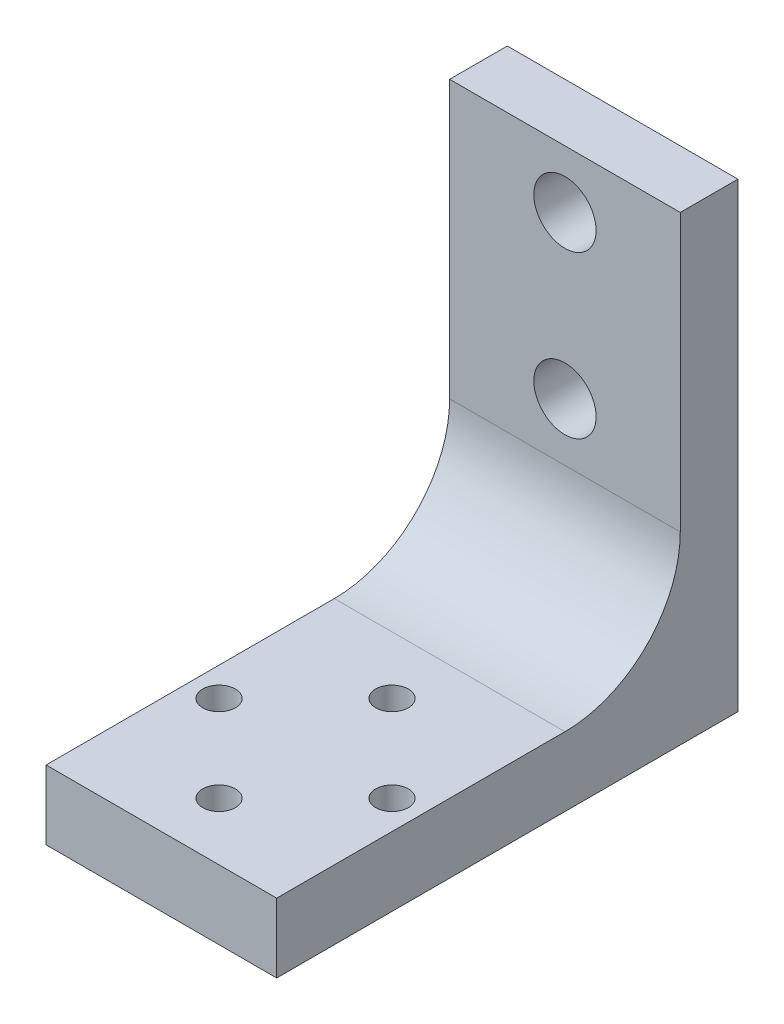
ISO-10303-21;
HEADER;
FILE_DESCRIPTION(('STEP AP214'),'2;1');
FILE_NAME('part.step','',(''),(''),'','','');
FILE_SCHEMA(('AUTOMOTIVE_DESIGN { 1 0 10303 214 1 1 1 1 }'));
ENDSEC;
DATA;
#1=APPLICATION_CONTEXT('core data for automotive mechanical design processes');
#2=APPLICATION_PROTOCOL_DEFINITION('international standard','automotive_design',2000,#1);
#3=PRODUCT_CONTEXT('',#1,'mechanical');
#4=PRODUCT('Part','Part','',(#3));
#5=PRODUCT_RELATED_PRODUCT_CATEGORY('part','',(#4));
#6=PRODUCT_DEFINITION_FORMATION('','',#4);
#7=PRODUCT_DEFINITION_CONTEXT('part definition',#1,'design');
#8=PRODUCT_DEFINITION('design','',#6,#7);
#9=PRODUCT_DEFINITION_SHAPE('','',#8);
#10=(LENGTH_UNIT() NAMED_UNIT(*) SI_UNIT(.MILLI.,.METRE.));
#11=(NAMED_UNIT(*) PLANE_ANGLE_UNIT() SI_UNIT($,.RADIAN.));
#12=(NAMED_UNIT(*) SI_UNIT($,.STERADIAN.) SOLID_ANGLE_UNIT());
#13=UNCERTAINTY_MEASURE_WITH_UNIT(LENGTH_MEASURE(1.E-05),#10,'distance_accuracy_value','');
#14=(GEOMETRIC_REPRESENTATION_CONTEXT(3) GLOBAL_UNCERTAINTY_ASSIGNED_CONTEXT((#13)) GLOBAL_UNIT_ASSIGNED_CONTEXT((#10,
#11,#12)) REPRESENTATION_CONTEXT('',''));
#15=CARTESIAN_POINT('',(0.,0.,0.));
#16=DIRECTION('',(0.,0.,1.));
#17=DIRECTION('',(1.,0.,0.));
#18=AXIS2_PLACEMENT_3D('',#15,#16,#17);
#19=CARTESIAN_POINT('',(0.,0.,6.35));
#20=DIRECTION('',(1.,0.,0.));
#21=DIRECTION('',(0.,0.,-1.));
#22=AXIS2_PLACEMENT_3D('',#19,#20,#21);
#23=PLANE('',#22);
#24=DIRECTION('',(0.,-1.,0.));
#25=VECTOR('',#24,1.);
#26=CARTESIAN_POINT('',(0.,0.,0.));
#27=LINE('',#26,#25);
#28=CARTESIAN_POINT('',(0.,50.8,0.));
#29=VERTEX_POINT('',#28);
#30=CARTESIAN_POINT('',(0.,0.,0.));
#31=VERTEX_POINT('',#30);
#32=EDGE_CURVE('E130',#29,#31,#27,.T.);
#33=ORIENTED_EDGE('',*,*,#32,.T.);
#34=DIRECTION('',(0.,0.,-1.));
#35=VECTOR('',#34,1.);
#36=CARTESIAN_POINT('',(0.,0.,6.35));
#37=LINE('',#36,#35);
#38=CARTESIAN_POINT('',(0.,0.,50.8));
#39=VERTEX_POINT('',#38);
#40=EDGE_CURVE('E117',#39,#31,#37,.T.);
#41=ORIENTED_EDGE('',*,*,#40,.F.);
#42=DIRECTION('',(0.,-1.,0.));
#43=VECTOR('',#42,1.);
#44=CARTESIAN_POINT('',(0.,0.,50.8));
#45=LINE('',#44,#43);
#46=CARTESIAN_POINT('',(0.,7.61999999999999,50.8));
#47=VERTEX_POINT('',#46);
#48=EDGE_CURVE('E104',#47,#39,#45,.T.);
#49=ORIENTED_EDGE('',*,*,#48,.F.);
#50=DIRECTION('',(0.,0.,1.));
#51=VECTOR('',#50,1.);
#52=CARTESIAN_POINT('',(0.,7.61999999999999,50.8));
#53=LINE('',#52,#51);
#54=CARTESIAN_POINT('',(0.,7.61999999999999,19.05));
#55=VERTEX_POINT('',#54);
#56=EDGE_CURVE('E95',#55,#47,#53,.T.);
#57=ORIENTED_EDGE('',*,*,#56,.F.);
#58=CARTESIAN_POINT('',(0.,20.32,19.05));
#59=DIRECTION('',(1.,0.,0.));
#60=DIRECTION('',(0.,0.,-1.));
#61=AXIS2_PLACEMENT_3D('',#58,#59,#60);
#62=CIRCLE('',#61,12.7);
#63=CARTESIAN_POINT('',(0.,20.32,6.35));
#64=VERTEX_POINT('',#63);
#65=EDGE_CURVE('E11',#55,#64,#62,.T.);
#66=ORIENTED_EDGE('',*,*,#65,.T.);
#67=DIRECTION('',(0.,-1.,0.));
#68=VECTOR('',#67,1.);
#69=CARTESIAN_POINT('',(0.,0.,6.35));
#70=LINE('',#69,#68);
#71=CARTESIAN_POINT('',(0.,50.8,6.35));
#72=VERTEX_POINT('',#71);
#73=EDGE_CURVE('E132',#72,#64,#70,.T.);
#74=ORIENTED_EDGE('',*,*,#73,.F.);
#75=DIRECTION('',(0.,0.,-1.));
#76=VECTOR('',#75,1.);
#77=CARTESIAN_POINT('',(0.,50.8,6.35));
#78=LINE('',#77,#76);
#79=EDGE_CURVE('E143',#72,#29,#78,.T.);
#80=ORIENTED_EDGE('',*,*,#79,.T.);
#81=EDGE_LOOP('',(#33,#41,#49,#57,#66,#74,#80));
#82=FACE_BOUND('',#81,.T.);
#83=ADVANCED_FACE('F39',(#82),#23,.F.);
#84=CARTESIAN_POINT('',(0.,0.,6.35));
#85=DIRECTION('',(0.,1.,0.));
#86=DIRECTION('',(0.,0.,1.));
#87=AXIS2_PLACEMENT_3D('',#84,#85,#86);
#88=PLANE('',#87);
#89=CARTESIAN_POINT('',(22.225,0.,34.925));
#90=DIRECTION('',(0.,1.,0.));
#91=DIRECTION('',(0.,0.,1.));
#92=AXIS2_PLACEMENT_3D('',#89,#90,#91);
#93=CIRCLE('',#92,1.8);
#94=CARTESIAN_POINT('',(22.225,0.,36.725));
#95=VERTEX_POINT('',#94);
#96=EDGE_CURVE('E242',#95,#95,#93,.F.);
#97=ORIENTED_EDGE('',*,*,#96,.F.);
#98=EDGE_LOOP('',(#97));
#99=FACE_BOUND('',#98,.T.);
#100=CARTESIAN_POINT('',(12.7,0.,25.4));
#101=DIRECTION('',(0.,1.,0.));
#102=DIRECTION('',(0.,0.,1.));
#103=AXIS2_PLACEMENT_3D('',#100,#101,#102);
#104=CIRCLE('',#103,1.8);
#105=CARTESIAN_POINT('',(12.7,0.,27.2));
#106=VERTEX_POINT('',#105);
#107=EDGE_CURVE('E247',#106,#106,#104,.F.);
#108=ORIENTED_EDGE('',*,*,#107,.F.);
#109=EDGE_LOOP('',(#108));
#110=FACE_BOUND('',#109,.T.);
#111=CARTESIAN_POINT('',(12.7,0.,44.45));
#112=DIRECTION('',(0.,1.,0.));
#113=DIRECTION('',(0.,0.,1.));
#114=AXIS2_PLACEMENT_3D('',#111,#112,#113);
#115=CIRCLE('',#114,1.8);
#116=CARTESIAN_POINT('',(12.7,0.,46.25));
#117=VERTEX_POINT('',#116);
#118=EDGE_CURVE('E259',#117,#117,#115,.F.);
#119=ORIENTED_EDGE('',*,*,#118,.F.);
#120=EDGE_LOOP('',(#119));
#121=FACE_BOUND('',#120,.T.);
#122=CARTESIAN_POINT('',(3.175,0.,34.925));
#123=DIRECTION('',(0.,1.,0.));
#124=DIRECTION('',(0.,0.,1.));
#125=AXIS2_PLACEMENT_3D('',#122,#123,#124);
#126=CIRCLE('',#125,1.8);
#127=CARTESIAN_POINT('',(3.175,0.,36.725));
#128=VERTEX_POINT('',#127);
#129=EDGE_CURVE('E265',#128,#128,#126,.F.);
#130=ORIENTED_EDGE('',*,*,#129,.F.);
#131=EDGE_LOOP('',(#130));
#132=FACE_BOUND('',#131,.T.);
#133=DIRECTION('',(1.,0.,0.));
#134=VECTOR('',#133,1.);
#135=CARTESIAN_POINT('',(0.,0.,0.));
#136=LINE('',#135,#134);
#137=CARTESIAN_POINT('',(25.4,0.,0.));
#138=VERTEX_POINT('',#137);
#139=EDGE_CURVE('E146',#31,#138,#136,.T.);
#140=ORIENTED_EDGE('',*,*,#139,.T.);
#141=DIRECTION('',(0.,0.,-1.));
#142=VECTOR('',#141,1.);
#143=CARTESIAN_POINT('',(25.4,0.,6.35));
#144=LINE('',#143,#142);
#145=CARTESIAN_POINT('',(25.4,0.,50.8));
#146=VERTEX_POINT('',#145);
#147=EDGE_CURVE('E161',#146,#138,#144,.T.);
#148=ORIENTED_EDGE('',*,*,#147,.F.);
#149=DIRECTION('',(1.,0.,0.));
#150=VECTOR('',#149,1.);
#151=CARTESIAN_POINT('',(0.,0.,50.8));
#152=LINE('',#151,#150);
#153=EDGE_CURVE('E113',#39,#146,#152,.T.);
#154=ORIENTED_EDGE('',*,*,#153,.F.);
#155=ORIENTED_EDGE('',*,*,#40,.T.);
#156=EDGE_LOOP('',(#140,#148,#154,#155));
#157=FACE_BOUND('',#156,.T.);
#158=ADVANCED_FACE('F199',(#99,#110,#121,#132,#157),#88,.F.);
#159=CARTESIAN_POINT('',(25.4,0.,6.35));
#160=DIRECTION('',(-1.,0.,0.));
#161=DIRECTION('',(0.,0.,1.));
#162=AXIS2_PLACEMENT_3D('',#159,#160,#161);
#163=PLANE('',#162);
#164=DIRECTION('',(0.,1.,0.));
#165=VECTOR('',#164,1.);
#166=CARTESIAN_POINT('',(25.4,0.,0.));
#167=LINE('',#166,#165);
#168=CARTESIAN_POINT('',(25.4,50.8,0.));
#169=VERTEX_POINT('',#168);
#170=EDGE_CURVE('E149',#138,#169,#167,.T.);
#171=ORIENTED_EDGE('',*,*,#170,.T.);
#172=DIRECTION('',(0.,0.,-1.));
#173=VECTOR('',#172,1.);
#174=CARTESIAN_POINT('',(25.4,50.8,6.35));
#175=LINE('',#174,#173);
#176=CARTESIAN_POINT('',(25.4,50.8,6.35));
#177=VERTEX_POINT('',#176);
#178=EDGE_CURVE('E157',#177,#169,#175,.T.);
#179=ORIENTED_EDGE('',*,*,#178,.F.);
#180=DIRECTION('',(0.,1.,0.));
#181=VECTOR('',#180,1.);
#182=CARTESIAN_POINT('',(25.4,0.,6.35));
#183=LINE('',#182,#181);
#184=CARTESIAN_POINT('',(25.4,20.32,6.35));
#185=VERTEX_POINT('',#184);
#186=EDGE_CURVE('E136',#185,#177,#183,.T.);
#187=ORIENTED_EDGE('',*,*,#186,.F.);
#188=CARTESIAN_POINT('',(25.4,20.32,19.05));
#189=DIRECTION('',(-1.,0.,0.));
#190=DIRECTION('',(0.,0.,1.));
#191=AXIS2_PLACEMENT_3D('',#188,#189,#190);
#192=CIRCLE('',#191,12.7);
#193=CARTESIAN_POINT('',(25.4,7.61999999999999,19.05));
#194=VERTEX_POINT('',#193);
#195=EDGE_CURVE('E48',#185,#194,#192,.T.);
#196=ORIENTED_EDGE('',*,*,#195,.T.);
#197=DIRECTION('',(0.,0.,1.));
#198=VECTOR('',#197,1.);
#199=CARTESIAN_POINT('',(25.4,7.61999999999999,50.8));
#200=LINE('',#199,#198);
#201=CARTESIAN_POINT('',(25.4,7.61999999999999,50.8));
#202=VERTEX_POINT('',#201);
#203=EDGE_CURVE('E123',#194,#202,#200,.T.);
#204=ORIENTED_EDGE('',*,*,#203,.T.);
#205=DIRECTION('',(0.,-1.,0.));
#206=VECTOR('',#205,1.);
#207=CARTESIAN_POINT('',(25.4,0.,50.8));
#208=LINE('',#207,#206);
#209=EDGE_CURVE('E105',#202,#146,#208,.T.);
#210=ORIENTED_EDGE('',*,*,#209,.T.);
#211=ORIENTED_EDGE('',*,*,#147,.T.);
#212=EDGE_LOOP('',(#171,#179,#187,#196,#204,#210,#211));
#213=FACE_BOUND('',#212,.T.);
#214=ADVANCED_FACE('F179',(#213),#163,.F.);
#215=CARTESIAN_POINT('',(0.,50.8,6.35));
#216=DIRECTION('',(0.,-1.,0.));
#217=DIRECTION('',(0.,0.,-1.));
#218=AXIS2_PLACEMENT_3D('',#215,#216,#217);
#219=PLANE('',#218);
#220=DIRECTION('',(-1.,0.,0.));
#221=VECTOR('',#220,1.);
#222=CARTESIAN_POINT('',(0.,50.8,0.));
#223=LINE('',#222,#221);
#224=EDGE_CURVE('E137',#169,#29,#223,.T.);
#225=ORIENTED_EDGE('',*,*,#224,.T.);
#226=ORIENTED_EDGE('',*,*,#79,.F.);
#227=DIRECTION('',(-1.,0.,0.));
#228=VECTOR('',#227,1.);
#229=CARTESIAN_POINT('',(0.,50.8,6.35));
#230=LINE('',#229,#228);
#231=EDGE_CURVE('E140',#177,#72,#230,.T.);
#232=ORIENTED_EDGE('',*,*,#231,.F.);
#233=ORIENTED_EDGE('',*,*,#178,.T.);
#234=EDGE_LOOP('',(#225,#226,#232,#233));
#235=FACE_BOUND('',#234,.T.);
#236=ADVANCED_FACE('F185',(#235),#219,.F.);
#237=CARTESIAN_POINT('',(0.,0.,6.35));
#238=DIRECTION('',(0.,0.,-1.));
#239=DIRECTION('',(-1.,0.,0.));
#240=AXIS2_PLACEMENT_3D('',#237,#238,#239);
#241=PLANE('',#240);
#242=CARTESIAN_POINT('',(12.7,44.45,6.35));
#243=DIRECTION('',(0.,0.,1.));
#244=DIRECTION('',(1.,0.,0.));
#245=AXIS2_PLACEMENT_3D('',#242,#243,#244);
#246=CIRCLE('',#245,3.42900000000001);
#247=CARTESIAN_POINT('',(16.129,44.45,6.35));
#248=VERTEX_POINT('',#247);
#249=EDGE_CURVE('E276',#248,#248,#246,.T.);
#250=ORIENTED_EDGE('',*,*,#249,.F.);
#251=EDGE_LOOP('',(#250));
#252=FACE_BOUND('',#251,.T.);
#253=CARTESIAN_POINT('',(12.7,26.67,6.35));
#254=DIRECTION('',(0.,0.,1.));
#255=DIRECTION('',(1.,0.,0.));
#256=AXIS2_PLACEMENT_3D('',#253,#254,#255);
#257=CIRCLE('',#256,3.429);
#258=CARTESIAN_POINT('',(16.129,26.67,6.35));
#259=VERTEX_POINT('',#258);
#260=EDGE_CURVE('E251',#259,#259,#257,.T.);
#261=ORIENTED_EDGE('',*,*,#260,.F.);
#262=EDGE_LOOP('',(#261));
#263=FACE_BOUND('',#262,.T.);
#264=ORIENTED_EDGE('',*,*,#73,.T.);
#265=DIRECTION('',(1.,0.,0.));
#266=VECTOR('',#265,1.);
#267=CARTESIAN_POINT('',(0.,20.32,6.35));
#268=LINE('',#267,#266);
#269=EDGE_CURVE('E167',#64,#185,#268,.T.);
#270=ORIENTED_EDGE('',*,*,#269,.T.);
#271=ORIENTED_EDGE('',*,*,#186,.T.);
#272=ORIENTED_EDGE('',*,*,#231,.T.);
#273=EDGE_LOOP('',(#264,#270,#271,#272));
#274=FACE_BOUND('',#273,.T.);
#275=ADVANCED_FACE('F175',(#252,#263,#274),#241,.F.);
#276=CARTESIAN_POINT('',(0.,0.,0.));
#277=DIRECTION('',(0.,0.,-1.));
#278=DIRECTION('',(-1.,0.,0.));
#279=AXIS2_PLACEMENT_3D('',#276,#277,#278);
#280=PLANE('',#279);
#281=CARTESIAN_POINT('',(12.7,44.45,0.));
#282=DIRECTION('',(0.,0.,-1.));
#283=DIRECTION('',(-1.,0.,0.));
#284=AXIS2_PLACEMENT_3D('',#281,#282,#283);
#285=CIRCLE('',#284,3.42900000000001);
#286=CARTESIAN_POINT('',(9.27099999999999,44.45,0.));
#287=VERTEX_POINT('',#286);
#288=EDGE_CURVE('E126',#287,#287,#285,.F.);
#289=ORIENTED_EDGE('',*,*,#288,.T.);
#290=EDGE_LOOP('',(#289));
#291=FACE_BOUND('',#290,.T.);
#292=CARTESIAN_POINT('',(12.7,26.67,0.));
#293=DIRECTION('',(0.,0.,-1.));
#294=DIRECTION('',(-1.,0.,0.));
#295=AXIS2_PLACEMENT_3D('',#292,#293,#294);
#296=CIRCLE('',#295,3.429);
#297=CARTESIAN_POINT('',(9.271,26.67,0.));
#298=VERTEX_POINT('',#297);
#299=EDGE_CURVE('E280',#298,#298,#296,.F.);
#300=ORIENTED_EDGE('',*,*,#299,.T.);
#301=EDGE_LOOP('',(#300));
#302=FACE_BOUND('',#301,.T.);
#303=ORIENTED_EDGE('',*,*,#32,.F.);
#304=ORIENTED_EDGE('',*,*,#224,.F.);
#305=ORIENTED_EDGE('',*,*,#170,.F.);
#306=ORIENTED_EDGE('',*,*,#139,.F.);
#307=EDGE_LOOP('',(#303,#304,#305,#306));
#308=FACE_BOUND('',#307,.T.);
#309=ADVANCED_FACE('F210',(#291,#302,#308),#280,.T.);
#310=CARTESIAN_POINT('',(0.,0.,50.8));
#311=DIRECTION('',(0.,0.,1.));
#312=DIRECTION('',(1.,0.,0.));
#313=AXIS2_PLACEMENT_3D('',#310,#311,#312);
#314=PLANE('',#313);
#315=ORIENTED_EDGE('',*,*,#209,.F.);
#316=DIRECTION('',(1.,0.,0.));
#317=VECTOR('',#316,1.);
#318=CARTESIAN_POINT('',(0.,7.61999999999999,50.8));
#319=LINE('',#318,#317);
#320=EDGE_CURVE('E98',#47,#202,#319,.T.);
#321=ORIENTED_EDGE('',*,*,#320,.F.);
#322=ORIENTED_EDGE('',*,*,#48,.T.);
#323=ORIENTED_EDGE('',*,*,#153,.T.);
#324=EDGE_LOOP('',(#315,#321,#322,#323));
#325=FACE_BOUND('',#324,.T.);
#326=ADVANCED_FACE('F109',(#325),#314,.T.);
#327=CARTESIAN_POINT('',(0.,7.61999999999999,50.8));
#328=DIRECTION('',(0.,1.,0.));
#329=DIRECTION('',(0.,0.,1.));
#330=AXIS2_PLACEMENT_3D('',#327,#328,#329);
#331=PLANE('',#330);
#332=CARTESIAN_POINT('',(22.225,7.61999999999999,34.925));
#333=DIRECTION('',(0.,1.,0.));
#334=DIRECTION('',(0.,0.,1.));
#335=AXIS2_PLACEMENT_3D('',#332,#333,#334);
#336=CIRCLE('',#335,1.8);
#337=CARTESIAN_POINT('',(22.225,7.61999999999999,36.725));
#338=VERTEX_POINT('',#337);
#339=EDGE_CURVE('E245',#338,#338,#336,.T.);
#340=ORIENTED_EDGE('',*,*,#339,.F.);
#341=EDGE_LOOP('',(#340));
#342=FACE_BOUND('',#341,.T.);
#343=CARTESIAN_POINT('',(12.7,7.61999999999999,25.4));
#344=DIRECTION('',(0.,1.,0.));
#345=DIRECTION('',(0.,0.,1.));
#346=AXIS2_PLACEMENT_3D('',#343,#344,#345);
#347=CIRCLE('',#346,1.8);
#348=CARTESIAN_POINT('',(12.7,7.61999999999999,27.2));
#349=VERTEX_POINT('',#348);
#350=EDGE_CURVE('E254',#349,#349,#347,.T.);
#351=ORIENTED_EDGE('',*,*,#350,.F.);
#352=EDGE_LOOP('',(#351));
#353=FACE_BOUND('',#352,.T.);
#354=CARTESIAN_POINT('',(12.7,7.61999999999999,44.45));
#355=DIRECTION('',(0.,1.,0.));
#356=DIRECTION('',(0.,0.,1.));
#357=AXIS2_PLACEMENT_3D('',#354,#355,#356);
#358=CIRCLE('',#357,1.8);
#359=CARTESIAN_POINT('',(12.7,7.61999999999999,46.25));
#360=VERTEX_POINT('',#359);
#361=EDGE_CURVE('E261',#360,#360,#358,.T.);
#362=ORIENTED_EDGE('',*,*,#361,.F.);
#363=EDGE_LOOP('',(#362));
#364=FACE_BOUND('',#363,.T.);
#365=CARTESIAN_POINT('',(3.175,7.61999999999999,34.925));
#366=DIRECTION('',(0.,1.,0.));
#367=DIRECTION('',(0.,0.,1.));
#368=AXIS2_PLACEMENT_3D('',#365,#366,#367);
#369=CIRCLE('',#368,1.8);
#370=CARTESIAN_POINT('',(3.175,7.61999999999999,36.725));
#371=VERTEX_POINT('',#370);
#372=EDGE_CURVE('E269',#371,#371,#369,.T.);
#373=ORIENTED_EDGE('',*,*,#372,.F.);
#374=EDGE_LOOP('',(#373));
#375=FACE_BOUND('',#374,.T.);
#376=ORIENTED_EDGE('',*,*,#203,.F.);
#377=DIRECTION('',(1.,0.,0.));
#378=VECTOR('',#377,1.);
#379=CARTESIAN_POINT('',(0.,7.61999999999999,19.05));
#380=LINE('',#379,#378);
#381=EDGE_CURVE('E55',#194,#55,#380,.F.);
#382=ORIENTED_EDGE('',*,*,#381,.T.);
#383=ORIENTED_EDGE('',*,*,#56,.T.);
#384=ORIENTED_EDGE('',*,*,#320,.T.);
#385=EDGE_LOOP('',(#376,#382,#383,#384));
#386=FACE_BOUND('',#385,.T.);
#387=ADVANCED_FACE('F97',(#342,#353,#364,#375,#386),#331,.T.);
#388=CARTESIAN_POINT('',(0.,20.32,19.05));
#389=DIRECTION('',(1.,0.,0.));
#390=DIRECTION('',(0.,0.,-1.));
#391=AXIS2_PLACEMENT_3D('',#388,#389,#390);
#392=CYLINDRICAL_SURFACE('',#391,12.7);
#393=ORIENTED_EDGE('',*,*,#65,.F.);
#394=ORIENTED_EDGE('',*,*,#381,.F.);
#395=ORIENTED_EDGE('',*,*,#195,.F.);
#396=ORIENTED_EDGE('',*,*,#269,.F.);
#397=EDGE_LOOP('',(#393,#394,#395,#396));
#398=FACE_BOUND('',#397,.T.);
#399=ADVANCED_FACE('F41',(#398),#392,.F.);
#400=CARTESIAN_POINT('',(12.7,26.67,-9.6986766107547));
#401=DIRECTION('',(0.,0.,1.));
#402=DIRECTION('',(1.,0.,0.));
#403=AXIS2_PLACEMENT_3D('',#400,#401,#402);
#404=CYLINDRICAL_SURFACE('',#403,3.429);
#405=ORIENTED_EDGE('',*,*,#260,.T.);
#406=EDGE_LOOP('',(#405));
#407=FACE_BOUND('',#406,.T.);
#408=ORIENTED_EDGE('',*,*,#299,.F.);
#409=EDGE_LOOP('',(#408));
#410=FACE_BOUND('',#409,.T.);
#411=ADVANCED_FACE('F188',(#407,#410),#404,.F.);
#412=CARTESIAN_POINT('',(12.7,44.45,-9.6986766107547));
#413=DIRECTION('',(0.,0.,1.));
#414=DIRECTION('',(1.,0.,0.));
#415=AXIS2_PLACEMENT_3D('',#412,#413,#414);
#416=CYLINDRICAL_SURFACE('',#415,3.42900000000001);
#417=ORIENTED_EDGE('',*,*,#249,.T.);
#418=EDGE_LOOP('',(#417));
#419=FACE_BOUND('',#418,.T.);
#420=ORIENTED_EDGE('',*,*,#288,.F.);
#421=EDGE_LOOP('',(#420));
#422=FACE_BOUND('',#421,.T.);
#423=ADVANCED_FACE('F193',(#419,#422),#416,.F.);
#424=CARTESIAN_POINT('',(3.175,-5.09116882454315,34.925));
#425=DIRECTION('',(0.,1.,0.));
#426=DIRECTION('',(0.,0.,1.));
#427=AXIS2_PLACEMENT_3D('',#424,#425,#426);
#428=CYLINDRICAL_SURFACE('',#427,1.8);
#429=ORIENTED_EDGE('',*,*,#129,.T.);
#430=EDGE_LOOP('',(#429));
#431=FACE_BOUND('',#430,.T.);
#432=ORIENTED_EDGE('',*,*,#372,.T.);
#433=EDGE_LOOP('',(#432));
#434=FACE_BOUND('',#433,.T.);
#435=ADVANCED_FACE('F221',(#431,#434),#428,.F.);
#436=CARTESIAN_POINT('',(12.7,-5.09116882454315,44.45));
#437=DIRECTION('',(0.,1.,0.));
#438=DIRECTION('',(0.,0.,1.));
#439=AXIS2_PLACEMENT_3D('',#436,#437,#438);
#440=CYLINDRICAL_SURFACE('',#439,1.8);
#441=ORIENTED_EDGE('',*,*,#118,.T.);
#442=EDGE_LOOP('',(#441));
#443=FACE_BOUND('',#442,.T.);
#444=ORIENTED_EDGE('',*,*,#361,.T.);
#445=EDGE_LOOP('',(#444));
#446=FACE_BOUND('',#445,.T.);
#447=ADVANCED_FACE('F225',(#443,#446),#440,.F.);
#448=CARTESIAN_POINT('',(12.7,-5.09116882454315,25.4));
#449=DIRECTION('',(0.,1.,0.));
#450=DIRECTION('',(0.,0.,1.));
#451=AXIS2_PLACEMENT_3D('',#448,#449,#450);
#452=CYLINDRICAL_SURFACE('',#451,1.8);
#453=ORIENTED_EDGE('',*,*,#107,.T.);
#454=EDGE_LOOP('',(#453));
#455=FACE_BOUND('',#454,.T.);
#456=ORIENTED_EDGE('',*,*,#350,.T.);
#457=EDGE_LOOP('',(#456));
#458=FACE_BOUND('',#457,.T.);
#459=ADVANCED_FACE('F229',(#455,#458),#452,.F.);
#460=CARTESIAN_POINT('',(22.225,-5.09116882454315,34.925));
#461=DIRECTION('',(0.,1.,0.));
#462=DIRECTION('',(0.,0.,1.));
#463=AXIS2_PLACEMENT_3D('',#460,#461,#462);
#464=CYLINDRICAL_SURFACE('',#463,1.8);
#465=ORIENTED_EDGE('',*,*,#96,.T.);
#466=EDGE_LOOP('',(#465));
#467=FACE_BOUND('',#466,.T.);
#468=ORIENTED_EDGE('',*,*,#339,.T.);
#469=EDGE_LOOP('',(#468));
#470=FACE_BOUND('',#469,.T.);
#471=ADVANCED_FACE('F233',(#467,#470),#464,.F.);
#472=CLOSED_SHELL('',(#83,#158,#214,#236,#275,#309,#326,#387,#399,#411,#423,#435,#447,#459,#471));
#473=MANIFOLD_SOLID_BREP('B2',#472);
#474=ADVANCED_BREP_SHAPE_REPRESENTATION('',(#18,#473),#14);
#475=SHAPE_DEFINITION_REPRESENTATION(#9,#474);
ENDSEC;
END-ISO-10303-21;
